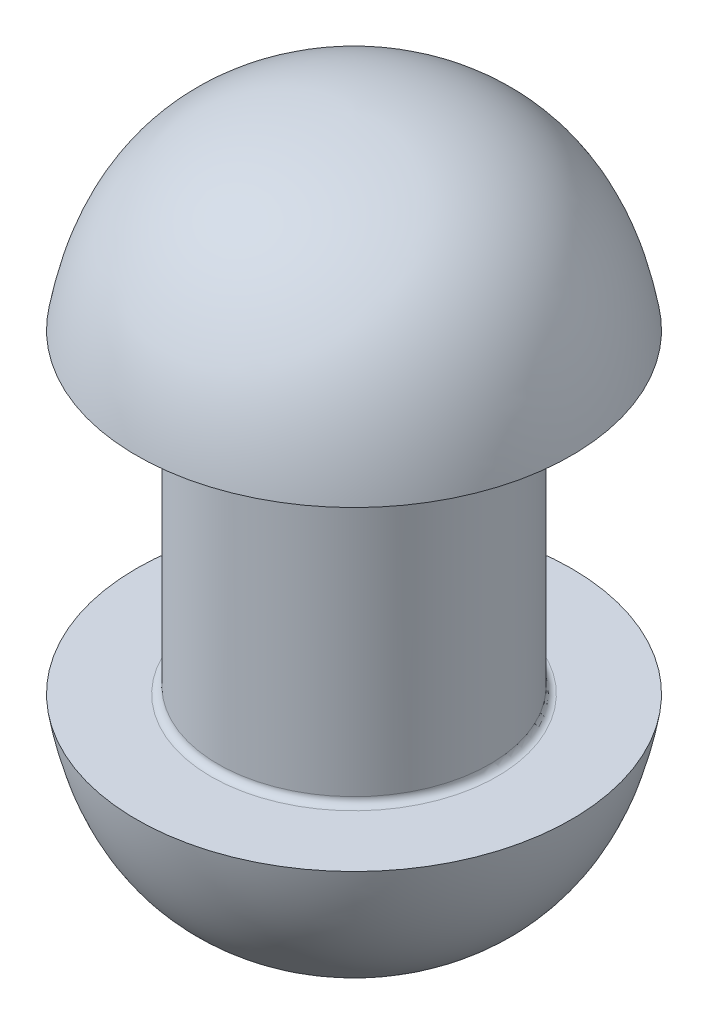
ISO-10303-21;
HEADER;
FILE_DESCRIPTION(('STEP AP214'),'2;1');
FILE_NAME('part.step','',(''),(''),'','','');
FILE_SCHEMA(('AUTOMOTIVE_DESIGN { 1 0 10303 214 1 1 1 1 }'));
ENDSEC;
DATA;
#1=APPLICATION_CONTEXT('core data for automotive mechanical design processes');
#2=APPLICATION_PROTOCOL_DEFINITION('international standard','automotive_design',2000,#1);
#3=PRODUCT_CONTEXT('',#1,'mechanical');
#4=PRODUCT('Part','Part','',(#3));
#5=PRODUCT_RELATED_PRODUCT_CATEGORY('part','',(#4));
#6=PRODUCT_DEFINITION_FORMATION('','',#4);
#7=PRODUCT_DEFINITION_CONTEXT('part definition',#1,'design');
#8=PRODUCT_DEFINITION('design','',#6,#7);
#9=PRODUCT_DEFINITION_SHAPE('','',#8);
#10=(LENGTH_UNIT() NAMED_UNIT(*) SI_UNIT(.MILLI.,.METRE.));
#11=(NAMED_UNIT(*) PLANE_ANGLE_UNIT() SI_UNIT($,.RADIAN.));
#12=(NAMED_UNIT(*) SI_UNIT($,.STERADIAN.) SOLID_ANGLE_UNIT());
#13=UNCERTAINTY_MEASURE_WITH_UNIT(LENGTH_MEASURE(1.E-05),#10,'distance_accuracy_value','');
#14=(GEOMETRIC_REPRESENTATION_CONTEXT(3) GLOBAL_UNCERTAINTY_ASSIGNED_CONTEXT((#13)) GLOBAL_UNIT_ASSIGNED_CONTEXT((#10,
#11,#12)) REPRESENTATION_CONTEXT('',''));
#15=CARTESIAN_POINT('',(0.,0.,0.));
#16=DIRECTION('',(0.,0.,1.));
#17=DIRECTION('',(1.,0.,0.));
#18=AXIS2_PLACEMENT_3D('',#15,#16,#17);
#19=CARTESIAN_POINT('',(0.,11.,0.));
#20=DIRECTION('',(0.,-1.,0.));
#21=DIRECTION('',(0.,0.,-1.));
#22=AXIS2_PLACEMENT_3D('',#19,#20,#21);
#23=CYLINDRICAL_SURFACE('',#22,9.48683298050514);
#24=CARTESIAN_POINT('',(0.,-10.5,0.));
#25=DIRECTION('',(0.,-1.,0.));
#26=DIRECTION('',(0.,0.,-1.));
#27=AXIS2_PLACEMENT_3D('',#24,#25,#26);
#28=CIRCLE('',#27,9.48683298050514);
#29=CARTESIAN_POINT('',(0.,-10.5,-9.48683298050514));
#30=VERTEX_POINT('',#29);
#31=EDGE_CURVE('E40',#30,#30,#28,.F.);
#32=ORIENTED_EDGE('',*,*,#31,.T.);
#33=EDGE_LOOP('',(#32));
#34=FACE_BOUND('',#33,.T.);
#35=CARTESIAN_POINT('',(0.,10.5,0.));
#36=DIRECTION('',(0.,1.,0.));
#37=DIRECTION('',(0.,0.,1.));
#38=AXIS2_PLACEMENT_3D('',#35,#36,#37);
#39=CIRCLE('',#38,9.48683298050514);
#40=CARTESIAN_POINT('',(0.,10.5,9.48683298050514));
#41=VERTEX_POINT('',#40);
#42=EDGE_CURVE('E92',#41,#41,#39,.F.);
#43=ORIENTED_EDGE('',*,*,#42,.T.);
#44=EDGE_LOOP('',(#43));
#45=FACE_BOUND('',#44,.T.);
#46=ADVANCED_FACE('F32',(#34,#45),#23,.T.);
#47=CARTESIAN_POINT('',(0.,11.,0.));
#48=DIRECTION('',(0.,1.,0.));
#49=DIRECTION('',(0.,0.,1.));
#50=AXIS2_PLACEMENT_3D('',#47,#48,#49);
#51=PLANE('',#50);
#52=CARTESIAN_POINT('',(0.,11.,0.));
#53=DIRECTION('',(0.,1.,0.));
#54=DIRECTION('',(0.,0.,1.));
#55=AXIS2_PLACEMENT_3D('',#52,#53,#54);
#56=CIRCLE('',#55,9.98683298050514);
#57=CARTESIAN_POINT('',(0.,11.,9.98683298050514));
#58=VERTEX_POINT('',#57);
#59=EDGE_CURVE('E11',#58,#58,#56,.T.);
#60=ORIENTED_EDGE('',*,*,#59,.T.);
#61=EDGE_LOOP('',(#60));
#62=FACE_BOUND('',#61,.T.);
#63=CARTESIAN_POINT('',(0.,11.,0.));
#64=DIRECTION('',(0.,-1.,0.));
#65=DIRECTION('',(0.,0.,-1.));
#66=AXIS2_PLACEMENT_3D('',#63,#64,#65);
#67=CIRCLE('',#66,15.1789327688082);
#68=CARTESIAN_POINT('',(0.,11.,-15.1789327688082));
#69=VERTEX_POINT('',#68);
#70=EDGE_CURVE('E83',#69,#69,#67,.T.);
#71=ORIENTED_EDGE('',*,*,#70,.T.);
#72=EDGE_LOOP('',(#71));
#73=FACE_BOUND('',#72,.T.);
#74=ADVANCED_FACE('F63',(#62,#73),#51,.F.);
#75=CARTESIAN_POINT('',(0.,24.2815661727072,0.));
#76=CARTESIAN_POINT('',(-13.0155756946009,23.9672552270898,0.));
#77=CARTESIAN_POINT('',(-15.1789327688082,11.,0.));
#78=B_SPLINE_CURVE_WITH_KNOTS('',2,(#75,#76,#77),.UNSPECIFIED.,.F.,.F.,(3,3),(0.,1.),.UNSPECIFIED.);
#79=CARTESIAN_POINT('',(0.,0.,0.));
#80=DIRECTION('',(0.,-1.,0.));
#81=AXIS1_PLACEMENT('',#79,#80);
#82=SURFACE_OF_REVOLUTION('',#78,#81);
#83=ORIENTED_EDGE('',*,*,#70,.F.);
#84=EDGE_LOOP('',(#83));
#85=FACE_BOUND('',#84,.T.);
#86=CARTESIAN_POINT('',(0.,24.2815661727072,0.));
#87=VERTEX_POINT('',#86);
#88=VERTEX_LOOP('',#87);
#89=FACE_BOUND('',#88,.T.);
#90=ADVANCED_FACE('F57',(#85,#89),#82,.T.);
#91=CARTESIAN_POINT('',(0.,-11.,0.));
#92=DIRECTION('',(0.,-1.,0.));
#93=DIRECTION('',(0.,0.,1.));
#94=AXIS2_PLACEMENT_3D('',#91,#92,#93);
#95=PLANE('',#94);
#96=CARTESIAN_POINT('',(0.,-11.,0.));
#97=DIRECTION('',(0.,-1.,0.));
#98=DIRECTION('',(0.,0.,-1.));
#99=AXIS2_PLACEMENT_3D('',#96,#97,#98);
#100=CIRCLE('',#99,9.98683298050514);
#101=CARTESIAN_POINT('',(0.,-11.,-9.98683298050514));
#102=VERTEX_POINT('',#101);
#103=EDGE_CURVE('E89',#102,#102,#100,.T.);
#104=ORIENTED_EDGE('',*,*,#103,.T.);
#105=EDGE_LOOP('',(#104));
#106=FACE_BOUND('',#105,.T.);
#107=CARTESIAN_POINT('',(0.,-11.,0.));
#108=DIRECTION('',(0.,-1.,0.));
#109=DIRECTION('',(0.,0.,-1.));
#110=AXIS2_PLACEMENT_3D('',#107,#108,#109);
#111=CIRCLE('',#110,15.1789327688082);
#112=CARTESIAN_POINT('',(0.,-11.,-15.1789327688082));
#113=VERTEX_POINT('',#112);
#114=EDGE_CURVE('E82',#113,#113,#111,.T.);
#115=ORIENTED_EDGE('',*,*,#114,.F.);
#116=EDGE_LOOP('',(#115));
#117=FACE_BOUND('',#116,.T.);
#118=ADVANCED_FACE('F49',(#106,#117),#95,.F.);
#119=CARTESIAN_POINT('',(0.,-24.2815661727072,0.));
#120=CARTESIAN_POINT('',(-13.0155756946009,-23.9672552270898,0.));
#121=CARTESIAN_POINT('',(-15.1789327688082,-11.,0.));
#122=B_SPLINE_CURVE_WITH_KNOTS('',2,(#119,#120,#121),.UNSPECIFIED.,.F.,.F.,(3,3),(0.,1.),.UNSPECIFIED.);
#123=CARTESIAN_POINT('',(0.,0.,0.));
#124=DIRECTION('',(0.,1.,0.));
#125=AXIS1_PLACEMENT('',#123,#124);
#126=SURFACE_OF_REVOLUTION('',#122,#125);
#127=ORIENTED_EDGE('',*,*,#114,.T.);
#128=EDGE_LOOP('',(#127));
#129=FACE_BOUND('',#128,.T.);
#130=CARTESIAN_POINT('',(0.,-24.2815661727072,0.));
#131=VERTEX_POINT('',#130);
#132=VERTEX_LOOP('',#131);
#133=FACE_BOUND('',#132,.T.);
#134=ADVANCED_FACE('F46',(#129,#133),#126,.T.);
#135=CARTESIAN_POINT('',(0.,-10.5,0.));
#136=DIRECTION('',(0.,-1.,0.));
#137=DIRECTION('',(0.,0.,-1.));
#138=AXIS2_PLACEMENT_3D('',#135,#136,#137);
#139=TOROIDAL_SURFACE('',#138,9.98683298050514,0.5);
#140=ORIENTED_EDGE('',*,*,#31,.F.);
#141=EDGE_LOOP('',(#140));
#142=FACE_BOUND('',#141,.T.);
#143=ORIENTED_EDGE('',*,*,#103,.F.);
#144=EDGE_LOOP('',(#143));
#145=FACE_BOUND('',#144,.T.);
#146=ADVANCED_FACE('F48',(#142,#145),#139,.F.);
#147=CARTESIAN_POINT('',(0.,10.5,0.));
#148=DIRECTION('',(0.,1.,0.));
#149=DIRECTION('',(0.,0.,1.));
#150=AXIS2_PLACEMENT_3D('',#147,#148,#149);
#151=TOROIDAL_SURFACE('',#150,9.98683298050514,0.5);
#152=ORIENTED_EDGE('',*,*,#42,.F.);
#153=EDGE_LOOP('',(#152));
#154=FACE_BOUND('',#153,.T.);
#155=ORIENTED_EDGE('',*,*,#59,.F.);
#156=EDGE_LOOP('',(#155));
#157=FACE_BOUND('',#156,.T.);
#158=ADVANCED_FACE('F34',(#154,#157),#151,.F.);
#159=CLOSED_SHELL('',(#46,#74,#90,#118,#134,#146,#158));
#160=MANIFOLD_SOLID_BREP('B2',#159);
#161=ADVANCED_BREP_SHAPE_REPRESENTATION('',(#18,#160),#14);
#162=SHAPE_DEFINITION_REPRESENTATION(#9,#161);
ENDSEC;
END-ISO-10303-21;
